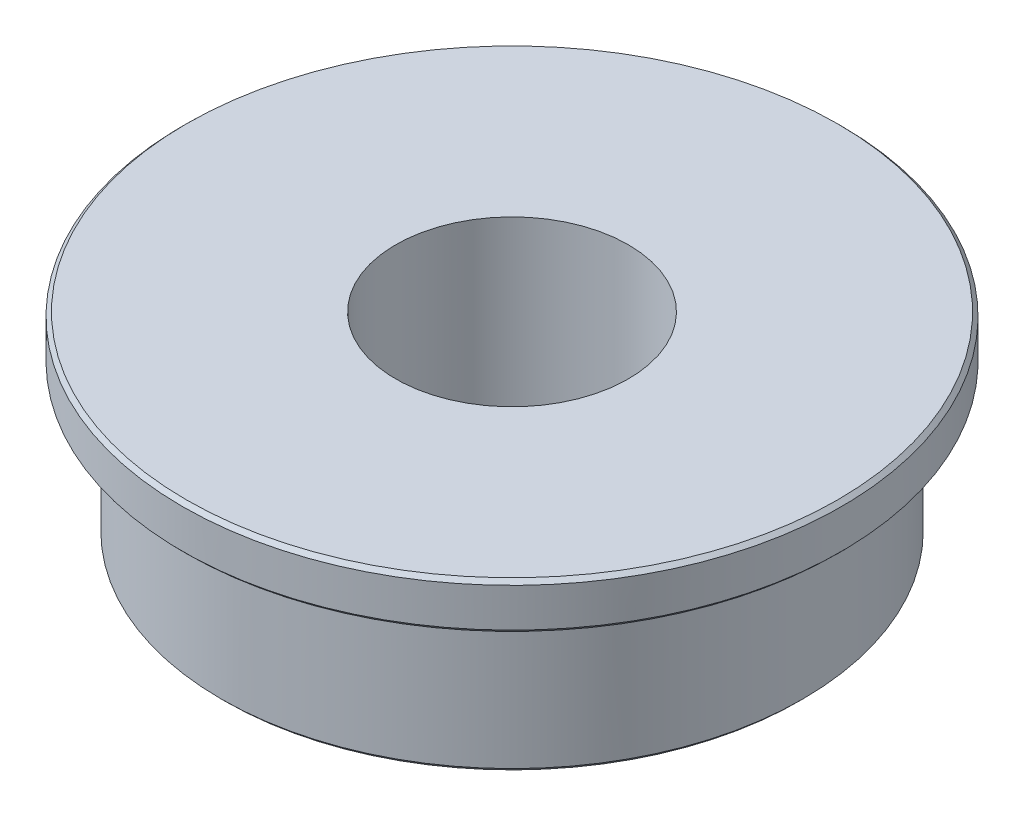
ISO-10303-21;
HEADER;
FILE_DESCRIPTION(('STEP AP214'),'2;1');
FILE_NAME('part.step','',(''),(''),'','','');
FILE_SCHEMA(('AUTOMOTIVE_DESIGN { 1 0 10303 214 1 1 1 1 }'));
ENDSEC;
DATA;
#1=APPLICATION_CONTEXT('core data for automotive mechanical design processes');
#2=APPLICATION_PROTOCOL_DEFINITION('international standard','automotive_design',2000,#1);
#3=PRODUCT_CONTEXT('',#1,'mechanical');
#4=PRODUCT('Part','Part','',(#3));
#5=PRODUCT_RELATED_PRODUCT_CATEGORY('part','',(#4));
#6=PRODUCT_DEFINITION_FORMATION('','',#4);
#7=PRODUCT_DEFINITION_CONTEXT('part definition',#1,'design');
#8=PRODUCT_DEFINITION('design','',#6,#7);
#9=PRODUCT_DEFINITION_SHAPE('','',#8);
#10=(LENGTH_UNIT() NAMED_UNIT(*) SI_UNIT(.MILLI.,.METRE.));
#11=(NAMED_UNIT(*) PLANE_ANGLE_UNIT() SI_UNIT($,.RADIAN.));
#12=(NAMED_UNIT(*) SI_UNIT($,.STERADIAN.) SOLID_ANGLE_UNIT());
#13=UNCERTAINTY_MEASURE_WITH_UNIT(LENGTH_MEASURE(1.E-05),#10,'distance_accuracy_value','');
#14=(GEOMETRIC_REPRESENTATION_CONTEXT(3) GLOBAL_UNCERTAINTY_ASSIGNED_CONTEXT((#13)) GLOBAL_UNIT_ASSIGNED_CONTEXT((#10,
#11,#12)) REPRESENTATION_CONTEXT('',''));
#15=CARTESIAN_POINT('',(0.,0.,0.));
#16=DIRECTION('',(0.,0.,1.));
#17=DIRECTION('',(1.,0.,0.));
#18=AXIS2_PLACEMENT_3D('',#15,#16,#17);
#19=CARTESIAN_POINT('',(7.5,0.,0.));
#20=DIRECTION('',(0.,-1.,0.));
#21=DIRECTION('',(0.,0.,-1.));
#22=AXIS2_PLACEMENT_3D('',#19,#20,#21);
#23=PLANE('',#22);
#24=CARTESIAN_POINT('',(0.,0.,0.));
#25=DIRECTION('',(0.,-1.,0.));
#26=DIRECTION('',(0.,0.,-1.));
#27=AXIS2_PLACEMENT_3D('',#24,#25,#26);
#28=CIRCLE('',#27,7.4);
#29=CARTESIAN_POINT('',(0.,0.,7.4));
#30=VERTEX_POINT('',#29);
#31=EDGE_CURVE('E58',#30,#30,#28,.T.);
#32=ORIENTED_EDGE('',*,*,#31,.T.);
#33=EDGE_LOOP('',(#32));
#34=FACE_BOUND('',#33,.T.);
#35=CARTESIAN_POINT('',(0.,0.,0.));
#36=DIRECTION('',(0.,-1.,0.));
#37=DIRECTION('',(0.,0.,-1.));
#38=AXIS2_PLACEMENT_3D('',#35,#36,#37);
#39=CIRCLE('',#38,3.);
#40=CARTESIAN_POINT('',(0.,0.,-3.));
#41=VERTEX_POINT('',#40);
#42=EDGE_CURVE('E61',#41,#41,#39,.T.);
#43=ORIENTED_EDGE('',*,*,#42,.F.);
#44=EDGE_LOOP('',(#43));
#45=FACE_BOUND('',#44,.T.);
#46=ADVANCED_FACE('F34',(#34,#45),#23,.T.);
#47=CARTESIAN_POINT('',(0.,0.,0.));
#48=DIRECTION('',(0.,-1.,0.));
#49=DIRECTION('',(0.,0.,-1.));
#50=AXIS2_PLACEMENT_3D('',#47,#48,#49);
#51=CYLINDRICAL_SURFACE('',#50,3.);
#52=ORIENTED_EDGE('',*,*,#42,.T.);
#53=EDGE_LOOP('',(#52));
#54=FACE_BOUND('',#53,.T.);
#55=CARTESIAN_POINT('',(0.,5.,0.));
#56=DIRECTION('',(0.,-1.,0.));
#57=DIRECTION('',(0.,0.,-1.));
#58=AXIS2_PLACEMENT_3D('',#55,#56,#57);
#59=CIRCLE('',#58,3.);
#60=CARTESIAN_POINT('',(0.,5.,-3.));
#61=VERTEX_POINT('',#60);
#62=EDGE_CURVE('E64',#61,#61,#59,.T.);
#63=ORIENTED_EDGE('',*,*,#62,.F.);
#64=EDGE_LOOP('',(#63));
#65=FACE_BOUND('',#64,.T.);
#66=ADVANCED_FACE('F88',(#54,#65),#51,.F.);
#67=CARTESIAN_POINT('',(3.,5.,0.));
#68=DIRECTION('',(0.,1.,0.));
#69=DIRECTION('',(0.,0.,1.));
#70=AXIS2_PLACEMENT_3D('',#67,#68,#69);
#71=PLANE('',#70);
#72=CARTESIAN_POINT('',(0.,5.,0.));
#73=DIRECTION('',(0.,1.,0.));
#74=DIRECTION('',(0.,0.,1.));
#75=AXIS2_PLACEMENT_3D('',#72,#73,#74);
#76=CIRCLE('',#75,8.4);
#77=CARTESIAN_POINT('',(0.,5.,8.4));
#78=VERTEX_POINT('',#77);
#79=EDGE_CURVE('E10',#78,#78,#76,.T.);
#80=ORIENTED_EDGE('',*,*,#79,.T.);
#81=EDGE_LOOP('',(#80));
#82=FACE_BOUND('',#81,.T.);
#83=ORIENTED_EDGE('',*,*,#62,.T.);
#84=EDGE_LOOP('',(#83));
#85=FACE_BOUND('',#84,.T.);
#86=ADVANCED_FACE('F85',(#82,#85),#71,.T.);
#87=CARTESIAN_POINT('',(0.,0.,0.));
#88=DIRECTION('',(0.,-1.,0.));
#89=DIRECTION('',(0.,0.,-1.));
#90=AXIS2_PLACEMENT_3D('',#87,#88,#89);
#91=CYLINDRICAL_SURFACE('',#90,8.5);
#92=CARTESIAN_POINT('',(0.,3.9,0.));
#93=DIRECTION('',(0.,-1.,0.));
#94=DIRECTION('',(0.,0.,-1.));
#95=AXIS2_PLACEMENT_3D('',#92,#93,#94);
#96=CIRCLE('',#95,8.5);
#97=CARTESIAN_POINT('',(0.,3.9,-8.5));
#98=VERTEX_POINT('',#97);
#99=EDGE_CURVE('E42',#98,#98,#96,.F.);
#100=ORIENTED_EDGE('',*,*,#99,.T.);
#101=EDGE_LOOP('',(#100));
#102=FACE_BOUND('',#101,.T.);
#103=CARTESIAN_POINT('',(0.,4.9,0.));
#104=DIRECTION('',(0.,1.,0.));
#105=DIRECTION('',(0.,0.,1.));
#106=AXIS2_PLACEMENT_3D('',#103,#104,#105);
#107=CIRCLE('',#106,8.5);
#108=CARTESIAN_POINT('',(0.,4.9,8.5));
#109=VERTEX_POINT('',#108);
#110=EDGE_CURVE('E46',#109,#109,#107,.F.);
#111=ORIENTED_EDGE('',*,*,#110,.T.);
#112=EDGE_LOOP('',(#111));
#113=FACE_BOUND('',#112,.T.);
#114=ADVANCED_FACE('F75',(#102,#113),#91,.T.);
#115=CARTESIAN_POINT('',(8.5,3.8,0.));
#116=DIRECTION('',(0.,-1.,0.));
#117=DIRECTION('',(0.,0.,-1.));
#118=AXIS2_PLACEMENT_3D('',#115,#116,#117);
#119=PLANE('',#118);
#120=CARTESIAN_POINT('',(0.,3.8,0.));
#121=DIRECTION('',(0.,-1.,0.));
#122=DIRECTION('',(0.,0.,-1.));
#123=AXIS2_PLACEMENT_3D('',#120,#121,#122);
#124=CIRCLE('',#123,8.4);
#125=CARTESIAN_POINT('',(0.,3.8,-8.4));
#126=VERTEX_POINT('',#125);
#127=EDGE_CURVE('E50',#126,#126,#124,.T.);
#128=ORIENTED_EDGE('',*,*,#127,.T.);
#129=EDGE_LOOP('',(#128));
#130=FACE_BOUND('',#129,.T.);
#131=CARTESIAN_POINT('',(0.,3.8,0.));
#132=DIRECTION('',(0.,-1.,0.));
#133=DIRECTION('',(0.,0.,-1.));
#134=AXIS2_PLACEMENT_3D('',#131,#132,#133);
#135=CIRCLE('',#134,7.5);
#136=CARTESIAN_POINT('',(0.,3.8,-7.5));
#137=VERTEX_POINT('',#136);
#138=EDGE_CURVE('E67',#137,#137,#135,.T.);
#139=ORIENTED_EDGE('',*,*,#138,.F.);
#140=EDGE_LOOP('',(#139));
#141=FACE_BOUND('',#140,.T.);
#142=ADVANCED_FACE('F73',(#130,#141),#119,.T.);
#143=CARTESIAN_POINT('',(0.,0.,0.));
#144=DIRECTION('',(0.,-1.,0.));
#145=DIRECTION('',(0.,0.,-1.));
#146=AXIS2_PLACEMENT_3D('',#143,#144,#145);
#147=CYLINDRICAL_SURFACE('',#146,7.5);
#148=CARTESIAN_POINT('',(0.,0.0999999999999971,0.));
#149=DIRECTION('',(0.,-1.,0.));
#150=DIRECTION('',(0.,0.,-1.));
#151=AXIS2_PLACEMENT_3D('',#148,#149,#150);
#152=CIRCLE('',#151,7.5);
#153=CARTESIAN_POINT('',(0.,0.0999999999999971,7.5));
#154=VERTEX_POINT('',#153);
#155=EDGE_CURVE('E55',#154,#154,#152,.F.);
#156=ORIENTED_EDGE('',*,*,#155,.T.);
#157=EDGE_LOOP('',(#156));
#158=FACE_BOUND('',#157,.T.);
#159=ORIENTED_EDGE('',*,*,#138,.T.);
#160=EDGE_LOOP('',(#159));
#161=FACE_BOUND('',#160,.T.);
#162=ADVANCED_FACE('F71',(#158,#161),#147,.T.);
#163=CARTESIAN_POINT('',(0.,0.,0.));
#164=DIRECTION('',(0.,1.,0.));
#165=DIRECTION('',(0.,0.,1.));
#166=AXIS2_PLACEMENT_3D('',#163,#164,#165);
#167=CONICAL_SURFACE('',#166,7.4,0.785398163397457);
#168=CARTESIAN_POINT('',(0.,0.0999999999999971,7.5));
#169=CARTESIAN_POINT('',(0.,0.0989583333333302,7.49895833333333));
#170=CARTESIAN_POINT('',(0.,0.0979166666666637,7.49791666666667));
#171=CARTESIAN_POINT('',(0.,0.0958333333333306,7.49583333333333));
#172=CARTESIAN_POINT('',(0.,0.094791666666664,7.49479166666667));
#173=CARTESIAN_POINT('',(0.,0.0927083333333307,7.49270833333333));
#174=CARTESIAN_POINT('',(0.,0.0916666666666641,7.49166666666667));
#175=CARTESIAN_POINT('',(0.,0.0895833333333307,7.48958333333333));
#176=CARTESIAN_POINT('',(0.,0.088541666666664,7.48854166666667));
#177=CARTESIAN_POINT('',(0.,0.0864583333333308,7.48645833333333));
#178=CARTESIAN_POINT('',(0.,0.0854166666666643,7.48541666666667));
#179=CARTESIAN_POINT('',(0.,0.083333333333331,7.48333333333333));
#180=CARTESIAN_POINT('',(0.,0.0822916666666644,7.48229166666667));
#181=CARTESIAN_POINT('',(0.,0.080208333333331,7.48020833333333));
#182=CARTESIAN_POINT('',(0.,0.0791666666666643,7.47916666666667));
#183=CARTESIAN_POINT('',(0.,0.0770833333333311,7.47708333333333));
#184=CARTESIAN_POINT('',(0.,0.0760416666666646,7.47604166666667));
#185=CARTESIAN_POINT('',(0.,0.0739583333333313,7.47395833333333));
#186=CARTESIAN_POINT('',(0.,0.0729166666666647,7.47291666666667));
#187=CARTESIAN_POINT('',(0.,0.0708333333333313,7.47083333333333));
#188=CARTESIAN_POINT('',(0.,0.0697916666666646,7.46979166666667));
#189=CARTESIAN_POINT('',(0.,0.0677083333333314,7.46770833333333));
#190=CARTESIAN_POINT('',(0.,0.0666666666666649,7.46666666666667));
#191=CARTESIAN_POINT('',(0.,0.0645833333333316,7.46458333333333));
#192=CARTESIAN_POINT('',(0.,0.063541666666665,7.46354166666667));
#193=CARTESIAN_POINT('',(0.,0.0614583333333316,7.46145833333333));
#194=CARTESIAN_POINT('',(0.,0.0604166666666649,7.46041666666667));
#195=CARTESIAN_POINT('',(0.,0.0583333333333317,7.45833333333333));
#196=CARTESIAN_POINT('',(0.,0.0572916666666652,7.45729166666667));
#197=CARTESIAN_POINT('',(0.,0.0552083333333319,7.45520833333333));
#198=CARTESIAN_POINT('',(0.,0.0541666666666653,7.45416666666667));
#199=CARTESIAN_POINT('',(0.,0.0520833333333319,7.45208333333333));
#200=CARTESIAN_POINT('',(0.,0.0510416666666652,7.45104166666667));
#201=CARTESIAN_POINT('',(0.,0.048958333333332,7.44895833333333));
#202=CARTESIAN_POINT('',(0.,0.0479166666666655,7.44791666666667));
#203=CARTESIAN_POINT('',(0.,0.0458333333333322,7.44583333333333));
#204=CARTESIAN_POINT('',(0.,0.0447916666666654,7.44479166666667));
#205=CARTESIAN_POINT('',(0.,0.0427083333333322,7.44270833333333));
#206=CARTESIAN_POINT('',(0.,0.0416666666666657,7.44166666666667));
#207=CARTESIAN_POINT('',(0.,0.0395833333333325,7.43958333333333));
#208=CARTESIAN_POINT('',(0.,0.0385416666666658,7.43854166666667));
#209=CARTESIAN_POINT('',(0.,0.0364583333333324,7.43645833333333));
#210=CARTESIAN_POINT('',(0.,0.0354166666666657,7.43541666666667));
#211=CARTESIAN_POINT('',(0.,0.0333333333333325,7.43333333333333));
#212=CARTESIAN_POINT('',(0.,0.032291666666666,7.43229166666667));
#213=CARTESIAN_POINT('',(0.,0.0302083333333327,7.43020833333333));
#214=CARTESIAN_POINT('',(0.,0.0291666666666661,7.42916666666667));
#215=CARTESIAN_POINT('',(0.,0.0270833333333327,7.42708333333333));
#216=CARTESIAN_POINT('',(0.,0.026041666666666,7.42604166666667));
#217=CARTESIAN_POINT('',(0.,0.0239583333333328,7.42395833333333));
#218=CARTESIAN_POINT('',(0.,0.0229166666666662,7.42291666666667));
#219=CARTESIAN_POINT('',(0.,0.020833333333333,7.42083333333333));
#220=CARTESIAN_POINT('',(0.,0.0197916666666664,7.41979166666667));
#221=CARTESIAN_POINT('',(0.,0.017708333333333,7.41770833333333));
#222=CARTESIAN_POINT('',(0.,0.0166666666666663,7.41666666666667));
#223=CARTESIAN_POINT('',(0.,0.0145833333333331,7.41458333333333));
#224=CARTESIAN_POINT('',(0.,0.0135416666666666,7.41354166666667));
#225=CARTESIAN_POINT('',(0.,0.0114583333333333,7.41145833333333));
#226=CARTESIAN_POINT('',(0.,0.0104166666666667,7.41041666666667));
#227=CARTESIAN_POINT('',(0.,0.0083333333333333,7.40833333333333));
#228=CARTESIAN_POINT('',(0.,0.00729166666666662,7.40729166666667));
#229=CARTESIAN_POINT('',(0.,0.00520833333333338,7.40520833333334));
#230=CARTESIAN_POINT('',(0.,0.00416666666666681,7.40416666666667));
#231=CARTESIAN_POINT('',(0.,0.00208333333333368,7.40208333333333));
#232=CARTESIAN_POINT('',(0.,0.00104166666666711,7.40104166666667));
#233=CARTESIAN_POINT('',(0.,0.,7.4));
#234=B_SPLINE_CURVE_WITH_KNOTS('',3,(#168,#169,#170,#171,#172,#173,#174,#175,#176,#177,#178,
#179,#180,#181,#182,#183,#184,#185,#186,#187,#188,#189,#190,#191,#192,#193,#194,#195,#196,#197,
#198,#199,#200,#201,#202,#203,#204,#205,#206,#207,#208,#209,#210,#211,#212,#213,#214,#215,#216,
#217,#218,#219,#220,#221,#222,#223,#224,#225,#226,#227,#228,#229,#230,#231,#232,#233),
.UNSPECIFIED.,.F.,.F.,(4,2,2,2,2,2,2,2,2,2,2,2,2,2,2,2,2,2,2,2,2,2,2,2,2,2,2,2,2,2,2,2,4),(0.,
0.00441941738241561,0.00883883476483183,0.0132582521472474,0.017677669529663,0.0220970869120793,
0.0265165042944949,0.0309359216769105,0.0353553390593267,0.0397747564417423,0.0441941738241579,
0.0486135912065741,0.0530330085889898,0.0574524259714054,0.0618718433538216,0.0662912607362372,
0.0707106781186528,0.075130095501069,0.0795495128834846,0.0839689302659008,0.0883883476483164,
0.0928077650307321,0.0972271824131483,0.101646599795564,0.106066017177979,0.110485434560396,
0.114904851942811,0.119324269325227,0.123743686707643,0.128163104090059,0.132582521472474,
0.137001938854891,0.141421356237306),.UNSPECIFIED.);
#235=EDGE_CURVE('BSEAM82',#154,#30,#234,.T.);
#236=ORIENTED_EDGE('',*,*,#155,.F.);
#237=ORIENTED_EDGE('',*,*,#31,.F.);
#238=ORIENTED_EDGE('',*,*,#235,.T.);
#239=ORIENTED_EDGE('',*,*,#235,.F.);
#240=EDGE_LOOP('',(#236,#238,#237,#239));
#241=FACE_BOUND('',#240,.T.);
#242=ADVANCED_FACE('F82',(#241),#167,.T.);
#243=CARTESIAN_POINT('',(0.,3.8,0.));
#244=DIRECTION('',(0.,1.,0.));
#245=DIRECTION('',(0.,0.,1.));
#246=AXIS2_PLACEMENT_3D('',#243,#244,#245);
#247=CONICAL_SURFACE('',#246,8.4,0.78539816339744);
#248=ORIENTED_EDGE('',*,*,#99,.F.);
#249=EDGE_LOOP('',(#248));
#250=FACE_BOUND('',#249,.T.);
#251=ORIENTED_EDGE('',*,*,#127,.F.);
#252=EDGE_LOOP('',(#251));
#253=FACE_BOUND('',#252,.T.);
#254=ADVANCED_FACE('F104',(#250,#253),#247,.T.);
#255=CARTESIAN_POINT('',(0.,4.9,0.));
#256=DIRECTION('',(0.,-1.,0.));
#257=DIRECTION('',(0.,0.,-1.));
#258=AXIS2_PLACEMENT_3D('',#255,#256,#257);
#259=CONICAL_SURFACE('',#258,8.5,0.78539816339744);
#260=ORIENTED_EDGE('',*,*,#79,.F.);
#261=EDGE_LOOP('',(#260));
#262=FACE_BOUND('',#261,.T.);
#263=ORIENTED_EDGE('',*,*,#110,.F.);
#264=EDGE_LOOP('',(#263));
#265=FACE_BOUND('',#264,.T.);
#266=ADVANCED_FACE('F37',(#262,#265),#259,.T.);
#267=CLOSED_SHELL('',(#46,#66,#86,#114,#142,#162,#242,#254,#266));
#268=MANIFOLD_SOLID_BREP('B2',#267);
#269=ADVANCED_BREP_SHAPE_REPRESENTATION('',(#18,#268),#14);
#270=SHAPE_DEFINITION_REPRESENTATION(#9,#269);
ENDSEC;
END-ISO-10303-21;
